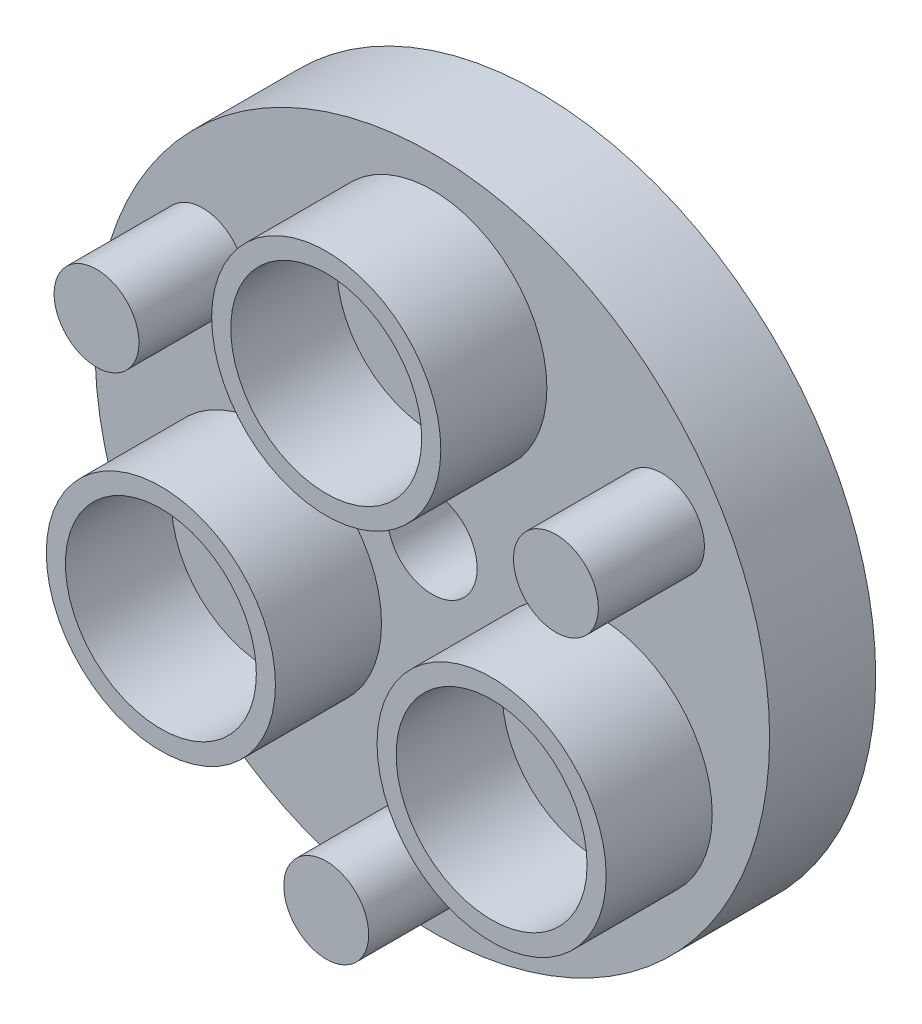
ISO-10303-21;
HEADER;
FILE_DESCRIPTION(('STEP AP214'),'2;1');
FILE_NAME('part.step','',(''),(''),'','','');
FILE_SCHEMA(('AUTOMOTIVE_DESIGN { 1 0 10303 214 1 1 1 1 }'));
ENDSEC;
DATA;
#1=APPLICATION_CONTEXT('core data for automotive mechanical design processes');
#2=APPLICATION_PROTOCOL_DEFINITION('international standard','automotive_design',2000,#1);
#3=PRODUCT_CONTEXT('',#1,'mechanical');
#4=PRODUCT('Part','Part','',(#3));
#5=PRODUCT_RELATED_PRODUCT_CATEGORY('part','',(#4));
#6=PRODUCT_DEFINITION_FORMATION('','',#4);
#7=PRODUCT_DEFINITION_CONTEXT('part definition',#1,'design');
#8=PRODUCT_DEFINITION('design','',#6,#7);
#9=PRODUCT_DEFINITION_SHAPE('','',#8);
#10=(LENGTH_UNIT() NAMED_UNIT(*) SI_UNIT(.MILLI.,.METRE.));
#11=(NAMED_UNIT(*) PLANE_ANGLE_UNIT() SI_UNIT($,.RADIAN.));
#12=(NAMED_UNIT(*) SI_UNIT($,.STERADIAN.) SOLID_ANGLE_UNIT());
#13=UNCERTAINTY_MEASURE_WITH_UNIT(LENGTH_MEASURE(1.E-05),#10,'distance_accuracy_value','');
#14=(GEOMETRIC_REPRESENTATION_CONTEXT(3) GLOBAL_UNCERTAINTY_ASSIGNED_CONTEXT((#13)) GLOBAL_UNIT_ASSIGNED_CONTEXT((#10,
#11,#12)) REPRESENTATION_CONTEXT('',''));
#15=CARTESIAN_POINT('',(0.,0.,0.));
#16=DIRECTION('',(0.,0.,1.));
#17=DIRECTION('',(1.,0.,0.));
#18=AXIS2_PLACEMENT_3D('',#15,#16,#17);
#19=CARTESIAN_POINT('',(0.,0.,-10.));
#20=DIRECTION('',(0.,0.,1.));
#21=DIRECTION('',(1.,0.,0.));
#22=AXIS2_PLACEMENT_3D('',#19,#20,#21);
#23=CYLINDRICAL_SURFACE('',#22,31.7948717948718);
#24=CARTESIAN_POINT('',(0.,0.,-10.));
#25=DIRECTION('',(0.,0.,1.));
#26=DIRECTION('',(1.,0.,0.));
#27=AXIS2_PLACEMENT_3D('',#24,#25,#26);
#28=CIRCLE('',#27,31.7948717948718);
#29=CARTESIAN_POINT('',(31.7948717948718,0.,-10.));
#30=VERTEX_POINT('',#29);
#31=EDGE_CURVE('E95',#30,#30,#28,.T.);
#32=ORIENTED_EDGE('',*,*,#31,.T.);
#33=EDGE_LOOP('',(#32));
#34=FACE_BOUND('',#33,.T.);
#35=CARTESIAN_POINT('',(0.,0.,0.));
#36=DIRECTION('',(0.,0.,1.));
#37=DIRECTION('',(1.,0.,0.));
#38=AXIS2_PLACEMENT_3D('',#35,#36,#37);
#39=CIRCLE('',#38,31.7948717948718);
#40=CARTESIAN_POINT('',(31.7948717948718,0.,0.));
#41=VERTEX_POINT('',#40);
#42=EDGE_CURVE('E49',#41,#41,#39,.T.);
#43=ORIENTED_EDGE('',*,*,#42,.F.);
#44=EDGE_LOOP('',(#43));
#45=FACE_BOUND('',#44,.T.);
#46=ADVANCED_FACE('F50',(#34,#45),#23,.T.);
#47=CARTESIAN_POINT('',(0.,0.,-10.));
#48=DIRECTION('',(0.,0.,1.));
#49=DIRECTION('',(1.,0.,0.));
#50=AXIS2_PLACEMENT_3D('',#47,#48,#49);
#51=PLANE('',#50);
#52=CARTESIAN_POINT('',(0.,0.,-10.));
#53=DIRECTION('',(0.,0.,-1.));
#54=DIRECTION('',(-1.,0.,0.));
#55=AXIS2_PLACEMENT_3D('',#52,#53,#54);
#56=CIRCLE('',#55,4.22254096063686);
#57=CARTESIAN_POINT('',(-4.22254096063686,0.,-10.));
#58=VERTEX_POINT('',#57);
#59=EDGE_CURVE('E240',#58,#58,#56,.T.);
#60=ORIENTED_EDGE('',*,*,#59,.F.);
#61=EDGE_LOOP('',(#60));
#62=FACE_BOUND('',#61,.T.);
#63=CARTESIAN_POINT('',(-3.03576608295941E-13,25.6410256410256,-10.));
#64=DIRECTION('',(0.,0.,-1.));
#65=DIRECTION('',(-1.,0.,0.));
#66=AXIS2_PLACEMENT_3D('',#63,#64,#65);
#67=CIRCLE('',#66,4.);
#68=CARTESIAN_POINT('',(-4.0000000000003,25.6410256410256,-10.));
#69=VERTEX_POINT('',#68);
#70=EDGE_CURVE('E261',#69,#69,#67,.T.);
#71=ORIENTED_EDGE('',*,*,#70,.F.);
#72=EDGE_LOOP('',(#71));
#73=FACE_BOUND('',#72,.T.);
#74=CARTESIAN_POINT('',(22.2057795842169,-12.8205128205131,-10.));
#75=DIRECTION('',(0.,0.,-1.));
#76=DIRECTION('',(-1.,0.,0.));
#77=AXIS2_PLACEMENT_3D('',#74,#75,#76);
#78=CIRCLE('',#77,4.);
#79=CARTESIAN_POINT('',(18.2057795842169,-12.8205128205131,-10.));
#80=VERTEX_POINT('',#79);
#81=EDGE_CURVE('E251',#80,#80,#78,.T.);
#82=ORIENTED_EDGE('',*,*,#81,.F.);
#83=EDGE_LOOP('',(#82));
#84=FACE_BOUND('',#83,.T.);
#85=CARTESIAN_POINT('',(4.8262693336482E-13,-25.6410256410256,-10.));
#86=DIRECTION('',(0.,0.,-1.));
#87=DIRECTION('',(-1.,0.,0.));
#88=AXIS2_PLACEMENT_3D('',#85,#86,#87);
#89=CIRCLE('',#88,4.);
#90=CARTESIAN_POINT('',(-3.99999999999952,-25.6410256410256,-10.));
#91=VERTEX_POINT('',#90);
#92=EDGE_CURVE('E279',#91,#91,#89,.T.);
#93=ORIENTED_EDGE('',*,*,#92,.F.);
#94=EDGE_LOOP('',(#93));
#95=FACE_BOUND('',#94,.T.);
#96=CARTESIAN_POINT('',(-22.2057795842162,-12.8205128205132,-10.));
#97=DIRECTION('',(0.,0.,-1.));
#98=DIRECTION('',(-1.,0.,0.));
#99=AXIS2_PLACEMENT_3D('',#96,#97,#98);
#100=CIRCLE('',#99,4.);
#101=CARTESIAN_POINT('',(-26.2057795842162,-12.8205128205132,-10.));
#102=VERTEX_POINT('',#101);
#103=EDGE_CURVE('E266',#102,#102,#100,.T.);
#104=ORIENTED_EDGE('',*,*,#103,.F.);
#105=EDGE_LOOP('',(#104));
#106=FACE_BOUND('',#105,.T.);
#107=CARTESIAN_POINT('',(22.2057795842167,12.8205128205128,-10.));
#108=DIRECTION('',(0.,0.,-1.));
#109=DIRECTION('',(-1.,0.,0.));
#110=AXIS2_PLACEMENT_3D('',#107,#108,#109);
#111=CIRCLE('',#110,4.);
#112=CARTESIAN_POINT('',(18.2057795842167,12.8205128205128,-10.));
#113=VERTEX_POINT('',#112);
#114=EDGE_CURVE('E246',#113,#113,#111,.T.);
#115=ORIENTED_EDGE('',*,*,#114,.F.);
#116=EDGE_LOOP('',(#115));
#117=FACE_BOUND('',#116,.T.);
#118=CARTESIAN_POINT('',(-22.2057795842166,12.8205128205125,-10.));
#119=DIRECTION('',(0.,0.,-1.));
#120=DIRECTION('',(-1.,0.,0.));
#121=AXIS2_PLACEMENT_3D('',#118,#119,#120);
#122=CIRCLE('',#121,4.);
#123=CARTESIAN_POINT('',(-26.2057795842166,12.8205128205125,-10.));
#124=VERTEX_POINT('',#123);
#125=EDGE_CURVE('E271',#124,#124,#122,.T.);
#126=ORIENTED_EDGE('',*,*,#125,.F.);
#127=EDGE_LOOP('',(#126));
#128=FACE_BOUND('',#127,.T.);
#129=ORIENTED_EDGE('',*,*,#31,.F.);
#130=EDGE_LOOP('',(#129));
#131=FACE_BOUND('',#130,.T.);
#132=ADVANCED_FACE('F109',(#62,#73,#84,#95,#106,#117,#128,#131),#51,.F.);
#133=CARTESIAN_POINT('',(0.,0.,0.));
#134=DIRECTION('',(0.,0.,1.));
#135=DIRECTION('',(1.,0.,0.));
#136=AXIS2_PLACEMENT_3D('',#133,#134,#135);
#137=PLANE('',#136);
#138=CARTESIAN_POINT('',(0.,0.,0.));
#139=DIRECTION('',(0.,0.,1.));
#140=DIRECTION('',(1.,0.,0.));
#141=AXIS2_PLACEMENT_3D('',#138,#139,#140);
#142=CIRCLE('',#141,4.22254096063686);
#143=CARTESIAN_POINT('',(4.22254096063686,0.,0.));
#144=VERTEX_POINT('',#143);
#145=EDGE_CURVE('E239',#144,#144,#142,.F.);
#146=ORIENTED_EDGE('',*,*,#145,.T.);
#147=EDGE_LOOP('',(#146));
#148=FACE_BOUND('',#147,.T.);
#149=CARTESIAN_POINT('',(0.,-25.,0.));
#150=DIRECTION('',(0.,0.,1.));
#151=DIRECTION('',(1.,0.,0.));
#152=AXIS2_PLACEMENT_3D('',#149,#150,#151);
#153=CIRCLE('',#152,4.);
#154=CARTESIAN_POINT('',(4.,-25.,0.));
#155=VERTEX_POINT('',#154);
#156=EDGE_CURVE('E10',#155,#155,#153,.T.);
#157=ORIENTED_EDGE('',*,*,#156,.F.);
#158=EDGE_LOOP('',(#157));
#159=FACE_BOUND('',#158,.T.);
#160=CARTESIAN_POINT('',(-15.5884572681199,-9.,0.));
#161=DIRECTION('',(0.,0.,1.));
#162=DIRECTION('',(1.,0.,0.));
#163=AXIS2_PLACEMENT_3D('',#160,#161,#162);
#164=CIRCLE('',#163,10.8);
#165=CARTESIAN_POINT('',(-4.7884572681199,-9.,0.));
#166=VERTEX_POINT('',#165);
#167=EDGE_CURVE('E54',#166,#166,#164,.T.);
#168=ORIENTED_EDGE('',*,*,#167,.F.);
#169=EDGE_LOOP('',(#168));
#170=FACE_BOUND('',#169,.T.);
#171=CARTESIAN_POINT('',(0.,18.,0.));
#172=DIRECTION('',(0.,0.,1.));
#173=DIRECTION('',(1.,0.,0.));
#174=AXIS2_PLACEMENT_3D('',#171,#172,#173);
#175=CIRCLE('',#174,10.8);
#176=CARTESIAN_POINT('',(10.8,18.,0.));
#177=VERTEX_POINT('',#176);
#178=EDGE_CURVE('E61',#177,#177,#175,.T.);
#179=ORIENTED_EDGE('',*,*,#178,.F.);
#180=EDGE_LOOP('',(#179));
#181=FACE_BOUND('',#180,.T.);
#182=CARTESIAN_POINT('',(21.650635094611,12.5,0.));
#183=DIRECTION('',(0.,0.,1.));
#184=DIRECTION('',(1.,0.,0.));
#185=AXIS2_PLACEMENT_3D('',#182,#183,#184);
#186=CIRCLE('',#185,4.);
#187=CARTESIAN_POINT('',(25.650635094611,12.5,0.));
#188=VERTEX_POINT('',#187);
#189=EDGE_CURVE('E288',#188,#188,#186,.T.);
#190=ORIENTED_EDGE('',*,*,#189,.F.);
#191=EDGE_LOOP('',(#190));
#192=FACE_BOUND('',#191,.T.);
#193=CARTESIAN_POINT('',(-21.650635094611,12.5,0.));
#194=DIRECTION('',(0.,0.,1.));
#195=DIRECTION('',(1.,0.,0.));
#196=AXIS2_PLACEMENT_3D('',#193,#194,#195);
#197=CIRCLE('',#196,4.);
#198=CARTESIAN_POINT('',(-17.650635094611,12.5,0.));
#199=VERTEX_POINT('',#198);
#200=EDGE_CURVE('E92',#199,#199,#197,.T.);
#201=ORIENTED_EDGE('',*,*,#200,.F.);
#202=EDGE_LOOP('',(#201));
#203=FACE_BOUND('',#202,.T.);
#204=CARTESIAN_POINT('',(15.5884572681199,-9.,0.));
#205=DIRECTION('',(0.,0.,1.));
#206=DIRECTION('',(1.,0.,0.));
#207=AXIS2_PLACEMENT_3D('',#204,#205,#206);
#208=CIRCLE('',#207,10.8);
#209=CARTESIAN_POINT('',(26.3884572681199,-9.,0.));
#210=VERTEX_POINT('',#209);
#211=EDGE_CURVE('E90',#210,#210,#208,.T.);
#212=ORIENTED_EDGE('',*,*,#211,.F.);
#213=EDGE_LOOP('',(#212));
#214=FACE_BOUND('',#213,.T.);
#215=ORIENTED_EDGE('',*,*,#42,.T.);
#216=EDGE_LOOP('',(#215));
#217=FACE_BOUND('',#216,.T.);
#218=ADVANCED_FACE('F110',(#148,#159,#170,#181,#192,#203,#214,#217),#137,.T.);
#219=CARTESIAN_POINT('',(15.5884572681199,-9.,10.));
#220=DIRECTION('',(0.,0.,1.));
#221=DIRECTION('',(1.,0.,0.));
#222=AXIS2_PLACEMENT_3D('',#219,#220,#221);
#223=PLANE('',#222);
#224=CARTESIAN_POINT('',(15.5884572681199,-9.,10.));
#225=DIRECTION('',(0.,0.,1.));
#226=DIRECTION('',(1.,0.,0.));
#227=AXIS2_PLACEMENT_3D('',#224,#225,#226);
#228=CIRCLE('',#227,10.8);
#229=CARTESIAN_POINT('',(26.3884572681199,-9.,10.));
#230=VERTEX_POINT('',#229);
#231=EDGE_CURVE('E79',#230,#230,#228,.T.);
#232=ORIENTED_EDGE('',*,*,#231,.T.);
#233=EDGE_LOOP('',(#232));
#234=FACE_BOUND('',#233,.T.);
#235=CARTESIAN_POINT('',(15.5884572681199,-9.,10.));
#236=DIRECTION('',(0.,0.,1.));
#237=DIRECTION('',(1.,0.,0.));
#238=AXIS2_PLACEMENT_3D('',#235,#236,#237);
#239=CIRCLE('',#238,9.);
#240=CARTESIAN_POINT('',(24.5884572681199,-9.,10.));
#241=VERTEX_POINT('',#240);
#242=EDGE_CURVE('E77',#241,#241,#239,.T.);
#243=ORIENTED_EDGE('',*,*,#242,.F.);
#244=EDGE_LOOP('',(#243));
#245=FACE_BOUND('',#244,.T.);
#246=ADVANCED_FACE('F120',(#234,#245),#223,.T.);
#247=CARTESIAN_POINT('',(15.5884572681199,-9.,10.));
#248=DIRECTION('',(0.,0.,-1.));
#249=DIRECTION('',(-1.,0.,0.));
#250=AXIS2_PLACEMENT_3D('',#247,#248,#249);
#251=CYLINDRICAL_SURFACE('',#250,10.8);
#252=ORIENTED_EDGE('',*,*,#231,.F.);
#253=EDGE_LOOP('',(#252));
#254=FACE_BOUND('',#253,.T.);
#255=ORIENTED_EDGE('',*,*,#211,.T.);
#256=EDGE_LOOP('',(#255));
#257=FACE_BOUND('',#256,.T.);
#258=ADVANCED_FACE('F121',(#254,#257),#251,.T.);
#259=CARTESIAN_POINT('',(15.5884572681199,-9.,10.));
#260=DIRECTION('',(0.,0.,-1.));
#261=DIRECTION('',(-1.,0.,0.));
#262=AXIS2_PLACEMENT_3D('',#259,#260,#261);
#263=CYLINDRICAL_SURFACE('',#262,9.);
#264=ORIENTED_EDGE('',*,*,#242,.T.);
#265=EDGE_LOOP('',(#264));
#266=FACE_BOUND('',#265,.T.);
#267=CARTESIAN_POINT('',(15.5884572681199,-9.,0.));
#268=DIRECTION('',(0.,0.,1.));
#269=DIRECTION('',(1.,0.,0.));
#270=AXIS2_PLACEMENT_3D('',#267,#268,#269);
#271=CIRCLE('',#270,9.);
#272=CARTESIAN_POINT('',(24.5884572681199,-9.,0.));
#273=VERTEX_POINT('',#272);
#274=EDGE_CURVE('E78',#273,#273,#271,.T.);
#275=ORIENTED_EDGE('',*,*,#274,.F.);
#276=EDGE_LOOP('',(#275));
#277=FACE_BOUND('',#276,.T.);
#278=ADVANCED_FACE('F130',(#266,#277),#263,.F.);
#279=CARTESIAN_POINT('',(-21.650635094611,12.5,10.));
#280=DIRECTION('',(0.,0.,-1.));
#281=DIRECTION('',(-1.,0.,0.));
#282=AXIS2_PLACEMENT_3D('',#279,#280,#281);
#283=CYLINDRICAL_SURFACE('',#282,4.);
#284=CARTESIAN_POINT('',(-21.650635094611,12.5,10.));
#285=DIRECTION('',(0.,0.,1.));
#286=DIRECTION('',(1.,0.,0.));
#287=AXIS2_PLACEMENT_3D('',#284,#285,#286);
#288=CIRCLE('',#287,4.);
#289=CARTESIAN_POINT('',(-17.650635094611,12.5,10.));
#290=VERTEX_POINT('',#289);
#291=EDGE_CURVE('E71',#290,#290,#288,.T.);
#292=ORIENTED_EDGE('',*,*,#291,.F.);
#293=EDGE_LOOP('',(#292));
#294=FACE_BOUND('',#293,.T.);
#295=ORIENTED_EDGE('',*,*,#200,.T.);
#296=EDGE_LOOP('',(#295));
#297=FACE_BOUND('',#296,.T.);
#298=ADVANCED_FACE('F133',(#294,#297),#283,.T.);
#299=CARTESIAN_POINT('',(-21.650635094611,12.5,10.));
#300=DIRECTION('',(0.,0.,1.));
#301=DIRECTION('',(1.,0.,0.));
#302=AXIS2_PLACEMENT_3D('',#299,#300,#301);
#303=PLANE('',#302);
#304=ORIENTED_EDGE('',*,*,#291,.T.);
#305=EDGE_LOOP('',(#304));
#306=FACE_BOUND('',#305,.T.);
#307=ADVANCED_FACE('F169',(#306),#303,.T.);
#308=CARTESIAN_POINT('',(21.650635094611,12.5,10.));
#309=DIRECTION('',(0.,0.,-1.));
#310=DIRECTION('',(-1.,0.,0.));
#311=AXIS2_PLACEMENT_3D('',#308,#309,#310);
#312=CYLINDRICAL_SURFACE('',#311,4.);
#313=CARTESIAN_POINT('',(21.650635094611,12.5,10.));
#314=DIRECTION('',(0.,0.,1.));
#315=DIRECTION('',(1.,0.,0.));
#316=AXIS2_PLACEMENT_3D('',#313,#314,#315);
#317=CIRCLE('',#316,4.);
#318=CARTESIAN_POINT('',(25.650635094611,12.5,10.));
#319=VERTEX_POINT('',#318);
#320=EDGE_CURVE('E295',#319,#319,#317,.T.);
#321=ORIENTED_EDGE('',*,*,#320,.F.);
#322=EDGE_LOOP('',(#321));
#323=FACE_BOUND('',#322,.T.);
#324=ORIENTED_EDGE('',*,*,#189,.T.);
#325=EDGE_LOOP('',(#324));
#326=FACE_BOUND('',#325,.T.);
#327=ADVANCED_FACE('F175',(#323,#326),#312,.T.);
#328=CARTESIAN_POINT('',(21.650635094611,12.5,10.));
#329=DIRECTION('',(0.,0.,1.));
#330=DIRECTION('',(1.,0.,0.));
#331=AXIS2_PLACEMENT_3D('',#328,#329,#330);
#332=PLANE('',#331);
#333=ORIENTED_EDGE('',*,*,#320,.T.);
#334=EDGE_LOOP('',(#333));
#335=FACE_BOUND('',#334,.T.);
#336=ADVANCED_FACE('F153',(#335),#332,.T.);
#337=CARTESIAN_POINT('',(0.,18.,10.));
#338=DIRECTION('',(0.,0.,1.));
#339=DIRECTION('',(1.,0.,0.));
#340=AXIS2_PLACEMENT_3D('',#337,#338,#339);
#341=PLANE('',#340);
#342=CARTESIAN_POINT('',(0.,18.,10.));
#343=DIRECTION('',(0.,0.,1.));
#344=DIRECTION('',(1.,0.,0.));
#345=AXIS2_PLACEMENT_3D('',#342,#343,#344);
#346=CIRCLE('',#345,10.8);
#347=CARTESIAN_POINT('',(10.8,18.,10.));
#348=VERTEX_POINT('',#347);
#349=EDGE_CURVE('E296',#348,#348,#346,.T.);
#350=ORIENTED_EDGE('',*,*,#349,.T.);
#351=EDGE_LOOP('',(#350));
#352=FACE_BOUND('',#351,.T.);
#353=CARTESIAN_POINT('',(0.,18.,10.));
#354=DIRECTION('',(0.,0.,1.));
#355=DIRECTION('',(1.,0.,0.));
#356=AXIS2_PLACEMENT_3D('',#353,#354,#355);
#357=CIRCLE('',#356,9.);
#358=CARTESIAN_POINT('',(9.,18.,10.));
#359=VERTEX_POINT('',#358);
#360=EDGE_CURVE('E70',#359,#359,#357,.T.);
#361=ORIENTED_EDGE('',*,*,#360,.F.);
#362=EDGE_LOOP('',(#361));
#363=FACE_BOUND('',#362,.T.);
#364=ADVANCED_FACE('F154',(#352,#363),#341,.T.);
#365=CARTESIAN_POINT('',(0.,18.,10.));
#366=DIRECTION('',(0.,0.,-1.));
#367=DIRECTION('',(-1.,0.,0.));
#368=AXIS2_PLACEMENT_3D('',#365,#366,#367);
#369=CYLINDRICAL_SURFACE('',#368,10.8);
#370=ORIENTED_EDGE('',*,*,#349,.F.);
#371=EDGE_LOOP('',(#370));
#372=FACE_BOUND('',#371,.T.);
#373=ORIENTED_EDGE('',*,*,#178,.T.);
#374=EDGE_LOOP('',(#373));
#375=FACE_BOUND('',#374,.T.);
#376=ADVANCED_FACE('F146',(#372,#375),#369,.T.);
#377=CARTESIAN_POINT('',(0.,18.,10.));
#378=DIRECTION('',(0.,0.,-1.));
#379=DIRECTION('',(-1.,0.,0.));
#380=AXIS2_PLACEMENT_3D('',#377,#378,#379);
#381=CYLINDRICAL_SURFACE('',#380,9.);
#382=ORIENTED_EDGE('',*,*,#360,.T.);
#383=EDGE_LOOP('',(#382));
#384=FACE_BOUND('',#383,.T.);
#385=CARTESIAN_POINT('',(0.,18.,0.));
#386=DIRECTION('',(0.,0.,1.));
#387=DIRECTION('',(1.,0.,0.));
#388=AXIS2_PLACEMENT_3D('',#385,#386,#387);
#389=CIRCLE('',#388,9.);
#390=CARTESIAN_POINT('',(9.,18.,0.));
#391=VERTEX_POINT('',#390);
#392=EDGE_CURVE('E309',#391,#391,#389,.T.);
#393=ORIENTED_EDGE('',*,*,#392,.F.);
#394=EDGE_LOOP('',(#393));
#395=FACE_BOUND('',#394,.T.);
#396=ADVANCED_FACE('F143',(#384,#395),#381,.F.);
#397=CARTESIAN_POINT('',(-15.5884572681199,-9.,10.));
#398=DIRECTION('',(0.,0.,1.));
#399=DIRECTION('',(1.,0.,0.));
#400=AXIS2_PLACEMENT_3D('',#397,#398,#399);
#401=PLANE('',#400);
#402=CARTESIAN_POINT('',(-15.5884572681199,-9.,10.));
#403=DIRECTION('',(0.,0.,1.));
#404=DIRECTION('',(1.,0.,0.));
#405=AXIS2_PLACEMENT_3D('',#402,#403,#404);
#406=CIRCLE('',#405,10.8);
#407=CARTESIAN_POINT('',(-4.7884572681199,-9.,10.));
#408=VERTEX_POINT('',#407);
#409=EDGE_CURVE('E304',#408,#408,#406,.T.);
#410=ORIENTED_EDGE('',*,*,#409,.T.);
#411=EDGE_LOOP('',(#410));
#412=FACE_BOUND('',#411,.T.);
#413=CARTESIAN_POINT('',(-15.5884572681199,-9.,10.));
#414=DIRECTION('',(0.,0.,1.));
#415=DIRECTION('',(1.,0.,0.));
#416=AXIS2_PLACEMENT_3D('',#413,#414,#415);
#417=CIRCLE('',#416,9.);
#418=CARTESIAN_POINT('',(-6.5884572681199,-9.,10.));
#419=VERTEX_POINT('',#418);
#420=EDGE_CURVE('E307',#419,#419,#417,.T.);
#421=ORIENTED_EDGE('',*,*,#420,.F.);
#422=EDGE_LOOP('',(#421));
#423=FACE_BOUND('',#422,.T.);
#424=ADVANCED_FACE('F149',(#412,#423),#401,.T.);
#425=CARTESIAN_POINT('',(-15.5884572681199,-9.,10.));
#426=DIRECTION('',(0.,0.,-1.));
#427=DIRECTION('',(-1.,0.,0.));
#428=AXIS2_PLACEMENT_3D('',#425,#426,#427);
#429=CYLINDRICAL_SURFACE('',#428,10.8);
#430=ORIENTED_EDGE('',*,*,#409,.F.);
#431=EDGE_LOOP('',(#430));
#432=FACE_BOUND('',#431,.T.);
#433=ORIENTED_EDGE('',*,*,#167,.T.);
#434=EDGE_LOOP('',(#433));
#435=FACE_BOUND('',#434,.T.);
#436=ADVANCED_FACE('F163',(#432,#435),#429,.T.);
#437=CARTESIAN_POINT('',(-15.5884572681199,-9.,10.));
#438=DIRECTION('',(0.,0.,-1.));
#439=DIRECTION('',(-1.,0.,0.));
#440=AXIS2_PLACEMENT_3D('',#437,#438,#439);
#441=CYLINDRICAL_SURFACE('',#440,9.);
#442=ORIENTED_EDGE('',*,*,#420,.T.);
#443=EDGE_LOOP('',(#442));
#444=FACE_BOUND('',#443,.T.);
#445=CARTESIAN_POINT('',(-15.5884572681199,-9.,0.));
#446=DIRECTION('',(0.,0.,1.));
#447=DIRECTION('',(1.,0.,0.));
#448=AXIS2_PLACEMENT_3D('',#445,#446,#447);
#449=CIRCLE('',#448,9.);
#450=CARTESIAN_POINT('',(-6.5884572681199,-9.,0.));
#451=VERTEX_POINT('',#450);
#452=EDGE_CURVE('E81',#451,#451,#449,.T.);
#453=ORIENTED_EDGE('',*,*,#452,.F.);
#454=EDGE_LOOP('',(#453));
#455=FACE_BOUND('',#454,.T.);
#456=ADVANCED_FACE('F141',(#444,#455),#441,.F.);
#457=CARTESIAN_POINT('',(0.,-25.,10.));
#458=DIRECTION('',(0.,0.,-1.));
#459=DIRECTION('',(-1.,0.,0.));
#460=AXIS2_PLACEMENT_3D('',#457,#458,#459);
#461=CYLINDRICAL_SURFACE('',#460,4.);
#462=CARTESIAN_POINT('',(0.,-25.,10.));
#463=DIRECTION('',(0.,0.,1.));
#464=DIRECTION('',(1.,0.,0.));
#465=AXIS2_PLACEMENT_3D('',#462,#463,#464);
#466=CIRCLE('',#465,4.);
#467=CARTESIAN_POINT('',(4.,-25.,10.));
#468=VERTEX_POINT('',#467);
#469=EDGE_CURVE('E67',#468,#468,#466,.T.);
#470=ORIENTED_EDGE('',*,*,#469,.F.);
#471=EDGE_LOOP('',(#470));
#472=FACE_BOUND('',#471,.T.);
#473=ORIENTED_EDGE('',*,*,#156,.T.);
#474=EDGE_LOOP('',(#473));
#475=FACE_BOUND('',#474,.T.);
#476=ADVANCED_FACE('F136',(#472,#475),#461,.T.);
#477=CARTESIAN_POINT('',(0.,-25.,10.));
#478=DIRECTION('',(0.,0.,1.));
#479=DIRECTION('',(1.,0.,0.));
#480=AXIS2_PLACEMENT_3D('',#477,#478,#479);
#481=PLANE('',#480);
#482=ORIENTED_EDGE('',*,*,#469,.T.);
#483=EDGE_LOOP('',(#482));
#484=FACE_BOUND('',#483,.T.);
#485=ADVANCED_FACE('F137',(#484),#481,.T.);
#486=ORIENTED_EDGE('',*,*,#274,.T.);
#487=EDGE_LOOP('',(#486));
#488=FACE_BOUND('',#487,.T.);
#489=ADVANCED_FACE('F119',(#488),#137,.T.);
#490=ORIENTED_EDGE('',*,*,#392,.T.);
#491=EDGE_LOOP('',(#490));
#492=FACE_BOUND('',#491,.T.);
#493=ADVANCED_FACE('F359',(#492),#137,.T.);
#494=ORIENTED_EDGE('',*,*,#452,.T.);
#495=EDGE_LOOP('',(#494));
#496=FACE_BOUND('',#495,.T.);
#497=ADVANCED_FACE('F118',(#496),#137,.T.);
#498=CARTESIAN_POINT('',(-22.2057795842166,12.8205128205125,-5.));
#499=DIRECTION('',(0.,0.,-1.));
#500=DIRECTION('',(-1.,0.,0.));
#501=AXIS2_PLACEMENT_3D('',#498,#499,#500);
#502=CYLINDRICAL_SURFACE('',#501,4.);
#503=CARTESIAN_POINT('',(-22.2057795842166,12.8205128205125,-5.));
#504=DIRECTION('',(0.,0.,-1.));
#505=DIRECTION('',(-1.,0.,0.));
#506=AXIS2_PLACEMENT_3D('',#503,#504,#505);
#507=CIRCLE('',#506,4.);
#508=CARTESIAN_POINT('',(-26.2057795842166,12.8205128205125,-5.));
#509=VERTEX_POINT('',#508);
#510=EDGE_CURVE('E73',#509,#509,#507,.T.);
#511=ORIENTED_EDGE('',*,*,#510,.F.);
#512=EDGE_LOOP('',(#511));
#513=FACE_BOUND('',#512,.T.);
#514=ORIENTED_EDGE('',*,*,#125,.T.);
#515=EDGE_LOOP('',(#514));
#516=FACE_BOUND('',#515,.T.);
#517=ADVANCED_FACE('F182',(#513,#516),#502,.F.);
#518=CARTESIAN_POINT('',(-22.2057795842166,12.8205128205125,-5.));
#519=DIRECTION('',(0.,0.,-1.));
#520=DIRECTION('',(-1.,0.,0.));
#521=AXIS2_PLACEMENT_3D('',#518,#519,#520);
#522=PLANE('',#521);
#523=ORIENTED_EDGE('',*,*,#510,.T.);
#524=EDGE_LOOP('',(#523));
#525=FACE_BOUND('',#524,.T.);
#526=ADVANCED_FACE('F187',(#525),#522,.T.);
#527=CARTESIAN_POINT('',(22.2057795842167,12.8205128205128,-5.));
#528=DIRECTION('',(0.,0.,-1.));
#529=DIRECTION('',(-1.,0.,0.));
#530=AXIS2_PLACEMENT_3D('',#527,#528,#529);
#531=CYLINDRICAL_SURFACE('',#530,4.);
#532=CARTESIAN_POINT('',(22.2057795842167,12.8205128205128,-5.));
#533=DIRECTION('',(0.,0.,-1.));
#534=DIRECTION('',(-1.,0.,0.));
#535=AXIS2_PLACEMENT_3D('',#532,#533,#534);
#536=CIRCLE('',#535,4.);
#537=CARTESIAN_POINT('',(18.2057795842167,12.8205128205128,-5.));
#538=VERTEX_POINT('',#537);
#539=EDGE_CURVE('E245',#538,#538,#536,.T.);
#540=ORIENTED_EDGE('',*,*,#539,.F.);
#541=EDGE_LOOP('',(#540));
#542=FACE_BOUND('',#541,.T.);
#543=ORIENTED_EDGE('',*,*,#114,.T.);
#544=EDGE_LOOP('',(#543));
#545=FACE_BOUND('',#544,.T.);
#546=ADVANCED_FACE('F188',(#542,#545),#531,.F.);
#547=CARTESIAN_POINT('',(22.2057795842167,12.8205128205128,-5.));
#548=DIRECTION('',(0.,0.,-1.));
#549=DIRECTION('',(-1.,0.,0.));
#550=AXIS2_PLACEMENT_3D('',#547,#548,#549);
#551=PLANE('',#550);
#552=ORIENTED_EDGE('',*,*,#539,.T.);
#553=EDGE_LOOP('',(#552));
#554=FACE_BOUND('',#553,.T.);
#555=ADVANCED_FACE('F206',(#554),#551,.T.);
#556=CARTESIAN_POINT('',(-22.2057795842162,-12.8205128205132,-5.));
#557=DIRECTION('',(0.,0.,-1.));
#558=DIRECTION('',(-1.,0.,0.));
#559=AXIS2_PLACEMENT_3D('',#556,#557,#558);
#560=CYLINDRICAL_SURFACE('',#559,4.);
#561=CARTESIAN_POINT('',(-22.2057795842162,-12.8205128205132,-5.));
#562=DIRECTION('',(0.,0.,-1.));
#563=DIRECTION('',(-1.,0.,0.));
#564=AXIS2_PLACEMENT_3D('',#561,#562,#563);
#565=CIRCLE('',#564,4.);
#566=CARTESIAN_POINT('',(-26.2057795842162,-12.8205128205132,-5.));
#567=VERTEX_POINT('',#566);
#568=EDGE_CURVE('E274',#567,#567,#565,.T.);
#569=ORIENTED_EDGE('',*,*,#568,.F.);
#570=EDGE_LOOP('',(#569));
#571=FACE_BOUND('',#570,.T.);
#572=ORIENTED_EDGE('',*,*,#103,.T.);
#573=EDGE_LOOP('',(#572));
#574=FACE_BOUND('',#573,.T.);
#575=ADVANCED_FACE('F201',(#571,#574),#560,.F.);
#576=CARTESIAN_POINT('',(-22.2057795842162,-12.8205128205132,-5.));
#577=DIRECTION('',(0.,0.,-1.));
#578=DIRECTION('',(-1.,0.,0.));
#579=AXIS2_PLACEMENT_3D('',#576,#577,#578);
#580=PLANE('',#579);
#581=ORIENTED_EDGE('',*,*,#568,.T.);
#582=EDGE_LOOP('',(#581));
#583=FACE_BOUND('',#582,.T.);
#584=ADVANCED_FACE('F197',(#583),#580,.T.);
#585=CARTESIAN_POINT('',(4.8262693336482E-13,-25.6410256410256,-5.));
#586=DIRECTION('',(0.,0.,-1.));
#587=DIRECTION('',(-1.,0.,0.));
#588=AXIS2_PLACEMENT_3D('',#585,#586,#587);
#589=CYLINDRICAL_SURFACE('',#588,4.);
#590=CARTESIAN_POINT('',(4.8262693336482E-13,-25.6410256410256,-5.));
#591=DIRECTION('',(0.,0.,-1.));
#592=DIRECTION('',(-1.,0.,0.));
#593=AXIS2_PLACEMENT_3D('',#590,#591,#592);
#594=CIRCLE('',#593,4.);
#595=CARTESIAN_POINT('',(-3.99999999999952,-25.6410256410256,-5.));
#596=VERTEX_POINT('',#595);
#597=EDGE_CURVE('E259',#596,#596,#594,.T.);
#598=ORIENTED_EDGE('',*,*,#597,.F.);
#599=EDGE_LOOP('',(#598));
#600=FACE_BOUND('',#599,.T.);
#601=ORIENTED_EDGE('',*,*,#92,.T.);
#602=EDGE_LOOP('',(#601));
#603=FACE_BOUND('',#602,.T.);
#604=ADVANCED_FACE('F199',(#600,#603),#589,.F.);
#605=CARTESIAN_POINT('',(4.8262693336482E-13,-25.6410256410256,-5.));
#606=DIRECTION('',(0.,0.,-1.));
#607=DIRECTION('',(-1.,0.,0.));
#608=AXIS2_PLACEMENT_3D('',#605,#606,#607);
#609=PLANE('',#608);
#610=ORIENTED_EDGE('',*,*,#597,.T.);
#611=EDGE_LOOP('',(#610));
#612=FACE_BOUND('',#611,.T.);
#613=ADVANCED_FACE('F195',(#612),#609,.T.);
#614=CARTESIAN_POINT('',(22.2057795842169,-12.8205128205131,-5.));
#615=DIRECTION('',(0.,0.,-1.));
#616=DIRECTION('',(-1.,0.,0.));
#617=AXIS2_PLACEMENT_3D('',#614,#615,#616);
#618=CYLINDRICAL_SURFACE('',#617,4.);
#619=CARTESIAN_POINT('',(22.2057795842169,-12.8205128205131,-5.));
#620=DIRECTION('',(0.,0.,-1.));
#621=DIRECTION('',(-1.,0.,0.));
#622=AXIS2_PLACEMENT_3D('',#619,#620,#621);
#623=CIRCLE('',#622,4.);
#624=CARTESIAN_POINT('',(18.2057795842169,-12.8205128205131,-5.));
#625=VERTEX_POINT('',#624);
#626=EDGE_CURVE('E256',#625,#625,#623,.T.);
#627=ORIENTED_EDGE('',*,*,#626,.F.);
#628=EDGE_LOOP('',(#627));
#629=FACE_BOUND('',#628,.T.);
#630=ORIENTED_EDGE('',*,*,#81,.T.);
#631=EDGE_LOOP('',(#630));
#632=FACE_BOUND('',#631,.T.);
#633=ADVANCED_FACE('F193',(#629,#632),#618,.F.);
#634=CARTESIAN_POINT('',(22.2057795842169,-12.8205128205131,-5.));
#635=DIRECTION('',(0.,0.,-1.));
#636=DIRECTION('',(-1.,0.,0.));
#637=AXIS2_PLACEMENT_3D('',#634,#635,#636);
#638=PLANE('',#637);
#639=ORIENTED_EDGE('',*,*,#626,.T.);
#640=EDGE_LOOP('',(#639));
#641=FACE_BOUND('',#640,.T.);
#642=ADVANCED_FACE('F220',(#641),#638,.T.);
#643=CARTESIAN_POINT('',(-3.03576608295941E-13,25.6410256410256,-5.));
#644=DIRECTION('',(0.,0.,-1.));
#645=DIRECTION('',(-1.,0.,0.));
#646=AXIS2_PLACEMENT_3D('',#643,#644,#645);
#647=CYLINDRICAL_SURFACE('',#646,4.);
#648=CARTESIAN_POINT('',(-3.03576608295941E-13,25.6410256410256,-5.));
#649=DIRECTION('',(0.,0.,-1.));
#650=DIRECTION('',(-1.,0.,0.));
#651=AXIS2_PLACEMENT_3D('',#648,#649,#650);
#652=CIRCLE('',#651,4.);
#653=CARTESIAN_POINT('',(-4.0000000000003,25.6410256410256,-5.));
#654=VERTEX_POINT('',#653);
#655=EDGE_CURVE('E255',#654,#654,#652,.T.);
#656=ORIENTED_EDGE('',*,*,#655,.F.);
#657=EDGE_LOOP('',(#656));
#658=FACE_BOUND('',#657,.T.);
#659=ORIENTED_EDGE('',*,*,#70,.T.);
#660=EDGE_LOOP('',(#659));
#661=FACE_BOUND('',#660,.T.);
#662=ADVANCED_FACE('F211',(#658,#661),#647,.F.);
#663=CARTESIAN_POINT('',(-3.03576608295941E-13,25.6410256410256,-5.));
#664=DIRECTION('',(0.,0.,-1.));
#665=DIRECTION('',(-1.,0.,0.));
#666=AXIS2_PLACEMENT_3D('',#663,#664,#665);
#667=PLANE('',#666);
#668=ORIENTED_EDGE('',*,*,#655,.T.);
#669=EDGE_LOOP('',(#668));
#670=FACE_BOUND('',#669,.T.);
#671=ADVANCED_FACE('F208',(#670),#667,.T.);
#672=CARTESIAN_POINT('',(0.,0.,11.9431493884171));
#673=DIRECTION('',(0.,0.,-1.));
#674=DIRECTION('',(-1.,0.,0.));
#675=AXIS2_PLACEMENT_3D('',#672,#673,#674);
#676=CYLINDRICAL_SURFACE('',#675,4.22254096063686);
#677=ORIENTED_EDGE('',*,*,#59,.T.);
#678=EDGE_LOOP('',(#677));
#679=FACE_BOUND('',#678,.T.);
#680=ORIENTED_EDGE('',*,*,#145,.F.);
#681=EDGE_LOOP('',(#680));
#682=FACE_BOUND('',#681,.T.);
#683=ADVANCED_FACE('F214',(#679,#682),#676,.F.);
#684=CLOSED_SHELL('',(#46,#132,#218,#246,#258,#278,#298,#307,#327,#336,#364,#376,#396,#424,#436,
#456,#476,#485,#489,#493,#497,#517,#526,#546,#555,#575,#584,#604,#613,#633,#642,#662,#671,#683));
#685=MANIFOLD_SOLID_BREP('B2',#684);
#686=ADVANCED_BREP_SHAPE_REPRESENTATION('',(#18,#685),#14);
#687=SHAPE_DEFINITION_REPRESENTATION(#9,#686);
ENDSEC;
END-ISO-10303-21;
